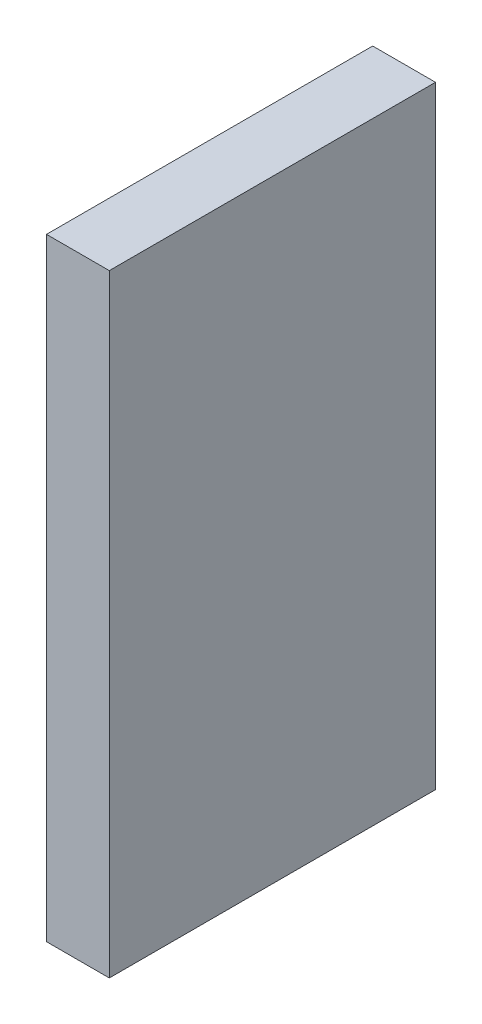
ISO-10303-21;
HEADER;
FILE_DESCRIPTION(('STEP AP214'),'2;1');
FILE_NAME('part.step','',(''),(''),'','','');
FILE_SCHEMA(('AUTOMOTIVE_DESIGN { 1 0 10303 214 1 1 1 1 }'));
ENDSEC;
DATA;
#1=APPLICATION_CONTEXT('core data for automotive mechanical design processes');
#2=APPLICATION_PROTOCOL_DEFINITION('international standard','automotive_design',2000,#1);
#3=PRODUCT_CONTEXT('',#1,'mechanical');
#4=PRODUCT('Part','Part','',(#3));
#5=PRODUCT_RELATED_PRODUCT_CATEGORY('part','',(#4));
#6=PRODUCT_DEFINITION_FORMATION('','',#4);
#7=PRODUCT_DEFINITION_CONTEXT('part definition',#1,'design');
#8=PRODUCT_DEFINITION('design','',#6,#7);
#9=PRODUCT_DEFINITION_SHAPE('','',#8);
#10=(LENGTH_UNIT() NAMED_UNIT(*) SI_UNIT(.MILLI.,.METRE.));
#11=(NAMED_UNIT(*) PLANE_ANGLE_UNIT() SI_UNIT($,.RADIAN.));
#12=(NAMED_UNIT(*) SI_UNIT($,.STERADIAN.) SOLID_ANGLE_UNIT());
#13=UNCERTAINTY_MEASURE_WITH_UNIT(LENGTH_MEASURE(1.E-05),#10,'distance_accuracy_value','');
#14=(GEOMETRIC_REPRESENTATION_CONTEXT(3) GLOBAL_UNCERTAINTY_ASSIGNED_CONTEXT((#13)) GLOBAL_UNIT_ASSIGNED_CONTEXT((#10,
#11,#12)) REPRESENTATION_CONTEXT('',''));
#15=CARTESIAN_POINT('',(0.,0.,0.));
#16=DIRECTION('',(0.,0.,1.));
#17=DIRECTION('',(1.,0.,0.));
#18=AXIS2_PLACEMENT_3D('',#15,#16,#17);
#19=CARTESIAN_POINT('',(8.554037880301,-5.199435016968,19.2));
#20=DIRECTION('',(0.,0.,-1.));
#21=DIRECTION('',(0.,-1.,0.));
#22=AXIS2_PLACEMENT_3D('',#19,#20,#21);
#23=PLANE('',#22);
#24=DIRECTION('',(1.,0.,0.));
#25=VECTOR('',#24,1.);
#26=CARTESIAN_POINT('',(8.457736602523,-4.260394194746,19.2));
#27=LINE('',#26,#25);
#28=CARTESIAN_POINT('',(8.457736602523,-4.260394194746,19.2));
#29=VERTEX_POINT('',#28);
#30=CARTESIAN_POINT('',(8.650339158079,-4.260394194746,19.2));
#31=VERTEX_POINT('',#30);
#32=EDGE_CURVE('E83',#29,#31,#27,.T.);
#33=ORIENTED_EDGE('',*,*,#32,.T.);
#34=DIRECTION('',(0.,-1.,0.));
#35=VECTOR('',#34,1.);
#36=CARTESIAN_POINT('',(8.650339158079,-4.260394194746,19.2));
#37=LINE('',#36,#35);
#38=CARTESIAN_POINT('',(8.650339158079,-6.13847583919,19.2));
#39=VERTEX_POINT('',#38);
#40=EDGE_CURVE('E72',#31,#39,#37,.T.);
#41=ORIENTED_EDGE('',*,*,#40,.T.);
#42=DIRECTION('',(-1.,0.,0.));
#43=VECTOR('',#42,1.);
#44=CARTESIAN_POINT('',(8.650339158079,-6.13847583919,19.2));
#45=LINE('',#44,#43);
#46=CARTESIAN_POINT('',(8.457736602523,-6.13847583919,19.2));
#47=VERTEX_POINT('',#46);
#48=EDGE_CURVE('E102',#39,#47,#45,.T.);
#49=ORIENTED_EDGE('',*,*,#48,.T.);
#50=DIRECTION('',(0.,1.,0.));
#51=VECTOR('',#50,1.);
#52=CARTESIAN_POINT('',(8.457736602523,-6.13847583919,19.2));
#53=LINE('',#52,#51);
#54=EDGE_CURVE('E11',#47,#29,#53,.T.);
#55=ORIENTED_EDGE('',*,*,#54,.T.);
#56=EDGE_LOOP('',(#33,#41,#49,#55));
#57=FACE_BOUND('',#56,.T.);
#58=ADVANCED_FACE('F16',(#57),#23,.T.);
#59=CARTESIAN_POINT('',(8.554037880301,-5.199435016968,20.2));
#60=DIRECTION('',(0.,0.,-1.));
#61=DIRECTION('',(0.,-1.,0.));
#62=AXIS2_PLACEMENT_3D('',#59,#60,#61);
#63=PLANE('',#62);
#64=DIRECTION('',(1.,0.,0.));
#65=VECTOR('',#64,1.);
#66=CARTESIAN_POINT('',(8.457736602523,-4.260394194746,20.2));
#67=LINE('',#66,#65);
#68=CARTESIAN_POINT('',(8.457736602523,-4.260394194746,20.2));
#69=VERTEX_POINT('',#68);
#70=CARTESIAN_POINT('',(8.650339158079,-4.260394194746,20.2));
#71=VERTEX_POINT('',#70);
#72=EDGE_CURVE('E90',#69,#71,#67,.T.);
#73=ORIENTED_EDGE('',*,*,#72,.F.);
#74=DIRECTION('',(0.,1.,0.));
#75=VECTOR('',#74,1.);
#76=CARTESIAN_POINT('',(8.457736602523,-6.13847583919,20.2));
#77=LINE('',#76,#75);
#78=CARTESIAN_POINT('',(8.457736602523,-6.13847583919,20.2));
#79=VERTEX_POINT('',#78);
#80=EDGE_CURVE('E27',#79,#69,#77,.T.);
#81=ORIENTED_EDGE('',*,*,#80,.F.);
#82=DIRECTION('',(-1.,0.,0.));
#83=VECTOR('',#82,1.);
#84=CARTESIAN_POINT('',(8.650339158079,-6.13847583919,20.2));
#85=LINE('',#84,#83);
#86=CARTESIAN_POINT('',(8.650339158079,-6.13847583919,20.2));
#87=VERTEX_POINT('',#86);
#88=EDGE_CURVE('E20',#87,#79,#85,.T.);
#89=ORIENTED_EDGE('',*,*,#88,.F.);
#90=DIRECTION('',(0.,-1.,0.));
#91=VECTOR('',#90,1.);
#92=CARTESIAN_POINT('',(8.650339158079,-4.260394194746,20.2));
#93=LINE('',#92,#91);
#94=EDGE_CURVE('E87',#71,#87,#93,.T.);
#95=ORIENTED_EDGE('',*,*,#94,.F.);
#96=EDGE_LOOP('',(#73,#81,#89,#95));
#97=FACE_BOUND('',#96,.T.);
#98=ADVANCED_FACE('F121',(#97),#63,.F.);
#99=CARTESIAN_POINT('',(8.457736602523,-5.199435016968,19.19));
#100=DIRECTION('',(1.,0.,0.));
#101=DIRECTION('',(0.,-1.,0.));
#102=AXIS2_PLACEMENT_3D('',#99,#100,#101);
#103=PLANE('',#102);
#104=DIRECTION('',(0.,0.,-1.));
#105=VECTOR('',#104,1.);
#106=CARTESIAN_POINT('',(8.457736602523,-6.13847583919,20.2));
#107=LINE('',#106,#105);
#108=EDGE_CURVE('E104',#79,#47,#107,.T.);
#109=ORIENTED_EDGE('',*,*,#108,.F.);
#110=ORIENTED_EDGE('',*,*,#80,.T.);
#111=DIRECTION('',(0.,0.,-1.));
#112=VECTOR('',#111,1.);
#113=CARTESIAN_POINT('',(8.457736602523,-4.260394194746,20.2));
#114=LINE('',#113,#112);
#115=EDGE_CURVE('E97',#69,#29,#114,.T.);
#116=ORIENTED_EDGE('',*,*,#115,.T.);
#117=ORIENTED_EDGE('',*,*,#54,.F.);
#118=EDGE_LOOP('',(#109,#110,#116,#117));
#119=FACE_BOUND('',#118,.T.);
#120=ADVANCED_FACE('F120',(#119),#103,.F.);
#121=CARTESIAN_POINT('',(8.554037880301,-6.13847583919,19.19));
#122=DIRECTION('',(0.,1.,0.));
#123=DIRECTION('',(1.,0.,0.));
#124=AXIS2_PLACEMENT_3D('',#121,#122,#123);
#125=PLANE('',#124);
#126=DIRECTION('',(0.,0.,-1.));
#127=VECTOR('',#126,1.);
#128=CARTESIAN_POINT('',(8.650339158079,-6.13847583919,20.2));
#129=LINE('',#128,#127);
#130=EDGE_CURVE('E78',#87,#39,#129,.T.);
#131=ORIENTED_EDGE('',*,*,#130,.F.);
#132=ORIENTED_EDGE('',*,*,#88,.T.);
#133=ORIENTED_EDGE('',*,*,#108,.T.);
#134=ORIENTED_EDGE('',*,*,#48,.F.);
#135=EDGE_LOOP('',(#131,#132,#133,#134));
#136=FACE_BOUND('',#135,.T.);
#137=ADVANCED_FACE('F114',(#136),#125,.F.);
#138=CARTESIAN_POINT('',(8.650339158079,-5.199435016968,19.19));
#139=DIRECTION('',(-1.,0.,0.));
#140=DIRECTION('',(0.,1.,0.));
#141=AXIS2_PLACEMENT_3D('',#138,#139,#140);
#142=PLANE('',#141);
#143=DIRECTION('',(0.,0.,-1.));
#144=VECTOR('',#143,1.);
#145=CARTESIAN_POINT('',(8.650339158079,-4.260394194746,20.2));
#146=LINE('',#145,#144);
#147=EDGE_CURVE('E76',#71,#31,#146,.T.);
#148=ORIENTED_EDGE('',*,*,#147,.F.);
#149=ORIENTED_EDGE('',*,*,#94,.T.);
#150=ORIENTED_EDGE('',*,*,#130,.T.);
#151=ORIENTED_EDGE('',*,*,#40,.F.);
#152=EDGE_LOOP('',(#148,#149,#150,#151));
#153=FACE_BOUND('',#152,.T.);
#154=ADVANCED_FACE('F18',(#153),#142,.F.);
#155=CARTESIAN_POINT('',(8.554037880301,-4.260394194746,19.19));
#156=DIRECTION('',(0.,-1.,0.));
#157=DIRECTION('',(0.,0.,-1.));
#158=AXIS2_PLACEMENT_3D('',#155,#156,#157);
#159=PLANE('',#158);
#160=ORIENTED_EDGE('',*,*,#115,.F.);
#161=ORIENTED_EDGE('',*,*,#72,.T.);
#162=ORIENTED_EDGE('',*,*,#147,.T.);
#163=ORIENTED_EDGE('',*,*,#32,.F.);
#164=EDGE_LOOP('',(#160,#161,#162,#163));
#165=FACE_BOUND('',#164,.T.);
#166=ADVANCED_FACE('F88',(#165),#159,.F.);
#167=CLOSED_SHELL('',(#58,#98,#120,#137,#154,#166));
#168=MANIFOLD_SOLID_BREP('B1',#167);
#169=ADVANCED_BREP_SHAPE_REPRESENTATION('',(#18,#168),#14);
#170=SHAPE_DEFINITION_REPRESENTATION(#9,#169);
ENDSEC;
END-ISO-10303-21;
